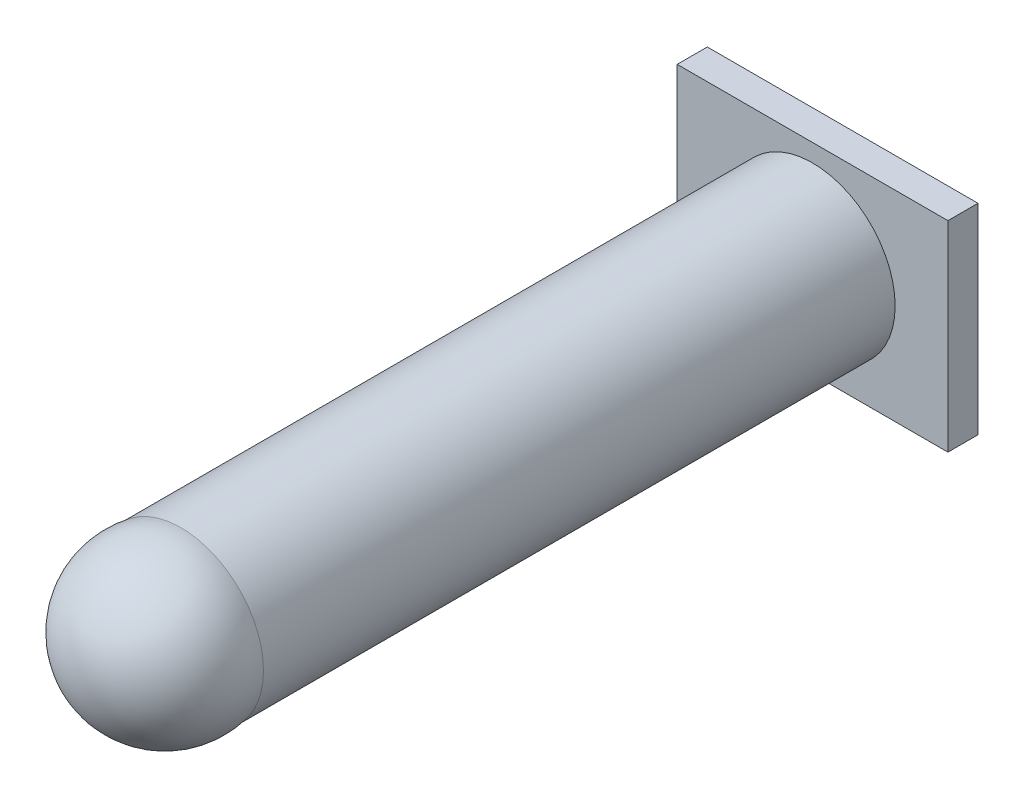
ISO-10303-21;
HEADER;
FILE_DESCRIPTION(('STEP AP214'),'2;1');
FILE_NAME('part.step','',(''),(''),'','','');
FILE_SCHEMA(('AUTOMOTIVE_DESIGN { 1 0 10303 214 1 1 1 1 }'));
ENDSEC;
DATA;
#1=APPLICATION_CONTEXT('core data for automotive mechanical design processes');
#2=APPLICATION_PROTOCOL_DEFINITION('international standard','automotive_design',2000,#1);
#3=PRODUCT_CONTEXT('',#1,'mechanical');
#4=PRODUCT('Part','Part','',(#3));
#5=PRODUCT_RELATED_PRODUCT_CATEGORY('part','',(#4));
#6=PRODUCT_DEFINITION_FORMATION('','',#4);
#7=PRODUCT_DEFINITION_CONTEXT('part definition',#1,'design');
#8=PRODUCT_DEFINITION('design','',#6,#7);
#9=PRODUCT_DEFINITION_SHAPE('','',#8);
#10=(LENGTH_UNIT() NAMED_UNIT(*) SI_UNIT(.MILLI.,.METRE.));
#11=(NAMED_UNIT(*) PLANE_ANGLE_UNIT() SI_UNIT($,.RADIAN.));
#12=(NAMED_UNIT(*) SI_UNIT($,.STERADIAN.) SOLID_ANGLE_UNIT());
#13=UNCERTAINTY_MEASURE_WITH_UNIT(LENGTH_MEASURE(1.E-05),#10,'distance_accuracy_value','');
#14=(GEOMETRIC_REPRESENTATION_CONTEXT(3) GLOBAL_UNCERTAINTY_ASSIGNED_CONTEXT((#13)) GLOBAL_UNIT_ASSIGNED_CONTEXT((#10,
#11,#12)) REPRESENTATION_CONTEXT('',''));
#15=CARTESIAN_POINT('',(0.,0.,0.));
#16=DIRECTION('',(0.,0.,1.));
#17=DIRECTION('',(1.,0.,0.));
#18=AXIS2_PLACEMENT_3D('',#15,#16,#17);
#19=CARTESIAN_POINT('',(-45.5198299492386,6.1198815566836,3.));
#20=DIRECTION('',(0.,0.,1.));
#21=DIRECTION('',(1.,0.,0.));
#22=AXIS2_PLACEMENT_3D('',#19,#20,#21);
#23=PLANE('',#22);
#24=DIRECTION('',(0.,-1.,0.));
#25=VECTOR('',#24,1.);
#26=CARTESIAN_POINT('',(-45.5198299492386,26.1198815566836,3.));
#27=LINE('',#26,#25);
#28=CARTESIAN_POINT('',(-45.5198299492386,26.1198815566836,3.));
#29=VERTEX_POINT('',#28);
#30=CARTESIAN_POINT('',(-45.5198299492386,6.1198815566836,3.));
#31=VERTEX_POINT('',#30);
#32=EDGE_CURVE('E86',#29,#31,#27,.T.);
#33=ORIENTED_EDGE('',*,*,#32,.T.);
#34=DIRECTION('',(1.,0.,0.));
#35=VECTOR('',#34,1.);
#36=CARTESIAN_POINT('',(-45.5198299492386,6.1198815566836,3.));
#37=LINE('',#36,#35);
#38=CARTESIAN_POINT('',(-18.5198299492386,6.1198815566836,3.));
#39=VERTEX_POINT('',#38);
#40=EDGE_CURVE('E81',#31,#39,#37,.T.);
#41=ORIENTED_EDGE('',*,*,#40,.T.);
#42=DIRECTION('',(0.,1.,0.));
#43=VECTOR('',#42,1.);
#44=CARTESIAN_POINT('',(-18.5198299492386,26.1198815566836,3.));
#45=LINE('',#44,#43);
#46=CARTESIAN_POINT('',(-18.5198299492386,26.1198815566836,3.));
#47=VERTEX_POINT('',#46);
#48=EDGE_CURVE('E84',#39,#47,#45,.T.);
#49=ORIENTED_EDGE('',*,*,#48,.T.);
#50=DIRECTION('',(-1.,0.,0.));
#51=VECTOR('',#50,1.);
#52=CARTESIAN_POINT('',(-45.5198299492386,26.1198815566836,3.));
#53=LINE('',#52,#51);
#54=EDGE_CURVE('E51',#47,#29,#53,.T.);
#55=ORIENTED_EDGE('',*,*,#54,.T.);
#56=EDGE_LOOP('',(#33,#41,#49,#55));
#57=FACE_BOUND('',#56,.T.);
#58=CARTESIAN_POINT('',(-32.0198299492386,16.1198815566836,3.));
#59=DIRECTION('',(0.,0.,1.));
#60=DIRECTION('',(1.,0.,0.));
#61=AXIS2_PLACEMENT_3D('',#58,#59,#60);
#62=CIRCLE('',#61,8.23653306005172);
#63=CARTESIAN_POINT('',(-23.7832968891869,16.1198815566836,3.));
#64=VERTEX_POINT('',#63);
#65=EDGE_CURVE('E113',#64,#64,#62,.T.);
#66=ORIENTED_EDGE('',*,*,#65,.F.);
#67=EDGE_LOOP('',(#66));
#68=FACE_BOUND('',#67,.T.);
#69=ADVANCED_FACE('F33',(#57,#68),#23,.T.);
#70=CARTESIAN_POINT('',(-45.5198299492386,26.1198815566836,3.));
#71=DIRECTION('',(1.,0.,0.));
#72=DIRECTION('',(0.,1.,0.));
#73=AXIS2_PLACEMENT_3D('',#70,#71,#72);
#74=PLANE('',#73);
#75=DIRECTION('',(0.,-1.,0.));
#76=VECTOR('',#75,1.);
#77=CARTESIAN_POINT('',(-45.5198299492386,26.1198815566836,0.));
#78=LINE('',#77,#76);
#79=CARTESIAN_POINT('',(-45.5198299492386,26.1198815566836,0.));
#80=VERTEX_POINT('',#79);
#81=CARTESIAN_POINT('',(-45.5198299492386,6.1198815566836,0.));
#82=VERTEX_POINT('',#81);
#83=EDGE_CURVE('E99',#80,#82,#78,.T.);
#84=ORIENTED_EDGE('',*,*,#83,.T.);
#85=DIRECTION('',(0.,0.,-1.));
#86=VECTOR('',#85,1.);
#87=CARTESIAN_POINT('',(-45.5198299492386,6.1198815566836,3.));
#88=LINE('',#87,#86);
#89=EDGE_CURVE('E11',#31,#82,#88,.T.);
#90=ORIENTED_EDGE('',*,*,#89,.F.);
#91=ORIENTED_EDGE('',*,*,#32,.F.);
#92=DIRECTION('',(0.,0.,-1.));
#93=VECTOR('',#92,1.);
#94=CARTESIAN_POINT('',(-45.5198299492386,26.1198815566836,3.));
#95=LINE('',#94,#93);
#96=EDGE_CURVE('E95',#29,#80,#95,.T.);
#97=ORIENTED_EDGE('',*,*,#96,.T.);
#98=EDGE_LOOP('',(#84,#90,#91,#97));
#99=FACE_BOUND('',#98,.T.);
#100=ADVANCED_FACE('F111',(#99),#74,.F.);
#101=CARTESIAN_POINT('',(-45.5198299492386,6.1198815566836,3.));
#102=DIRECTION('',(0.,1.,0.));
#103=DIRECTION('',(0.,0.,1.));
#104=AXIS2_PLACEMENT_3D('',#101,#102,#103);
#105=PLANE('',#104);
#106=DIRECTION('',(1.,0.,0.));
#107=VECTOR('',#106,1.);
#108=CARTESIAN_POINT('',(-45.5198299492386,6.1198815566836,0.));
#109=LINE('',#108,#107);
#110=CARTESIAN_POINT('',(-18.5198299492386,6.1198815566836,0.));
#111=VERTEX_POINT('',#110);
#112=EDGE_CURVE('E90',#82,#111,#109,.T.);
#113=ORIENTED_EDGE('',*,*,#112,.T.);
#114=DIRECTION('',(0.,0.,-1.));
#115=VECTOR('',#114,1.);
#116=CARTESIAN_POINT('',(-18.5198299492386,6.1198815566836,3.));
#117=LINE('',#116,#115);
#118=EDGE_CURVE('E43',#39,#111,#117,.T.);
#119=ORIENTED_EDGE('',*,*,#118,.F.);
#120=ORIENTED_EDGE('',*,*,#40,.F.);
#121=ORIENTED_EDGE('',*,*,#89,.T.);
#122=EDGE_LOOP('',(#113,#119,#120,#121));
#123=FACE_BOUND('',#122,.T.);
#124=ADVANCED_FACE('F89',(#123),#105,.F.);
#125=CARTESIAN_POINT('',(-18.5198299492386,26.1198815566836,3.));
#126=DIRECTION('',(-1.,0.,0.));
#127=DIRECTION('',(0.,-1.,0.));
#128=AXIS2_PLACEMENT_3D('',#125,#126,#127);
#129=PLANE('',#128);
#130=DIRECTION('',(0.,1.,0.));
#131=VECTOR('',#130,1.);
#132=CARTESIAN_POINT('',(-18.5198299492386,26.1198815566836,0.));
#133=LINE('',#132,#131);
#134=CARTESIAN_POINT('',(-18.5198299492386,26.1198815566836,0.));
#135=VERTEX_POINT('',#134);
#136=EDGE_CURVE('E68',#111,#135,#133,.T.);
#137=ORIENTED_EDGE('',*,*,#136,.T.);
#138=DIRECTION('',(0.,0.,-1.));
#139=VECTOR('',#138,1.);
#140=CARTESIAN_POINT('',(-18.5198299492386,26.1198815566836,3.));
#141=LINE('',#140,#139);
#142=EDGE_CURVE('E91',#47,#135,#141,.T.);
#143=ORIENTED_EDGE('',*,*,#142,.F.);
#144=ORIENTED_EDGE('',*,*,#48,.F.);
#145=ORIENTED_EDGE('',*,*,#118,.T.);
#146=EDGE_LOOP('',(#137,#143,#144,#145));
#147=FACE_BOUND('',#146,.T.);
#148=ADVANCED_FACE('F93',(#147),#129,.F.);
#149=CARTESIAN_POINT('',(-45.5198299492386,26.1198815566836,3.));
#150=DIRECTION('',(0.,-1.,0.));
#151=DIRECTION('',(0.,0.,-1.));
#152=AXIS2_PLACEMENT_3D('',#149,#150,#151);
#153=PLANE('',#152);
#154=DIRECTION('',(-1.,0.,0.));
#155=VECTOR('',#154,1.);
#156=CARTESIAN_POINT('',(-45.5198299492386,26.1198815566836,0.));
#157=LINE('',#156,#155);
#158=EDGE_CURVE('E74',#135,#80,#157,.T.);
#159=ORIENTED_EDGE('',*,*,#158,.T.);
#160=ORIENTED_EDGE('',*,*,#96,.F.);
#161=ORIENTED_EDGE('',*,*,#54,.F.);
#162=ORIENTED_EDGE('',*,*,#142,.T.);
#163=EDGE_LOOP('',(#159,#160,#161,#162));
#164=FACE_BOUND('',#163,.T.);
#165=ADVANCED_FACE('F106',(#164),#153,.F.);
#166=CARTESIAN_POINT('',(-45.5198299492386,6.1198815566836,0.));
#167=DIRECTION('',(0.,0.,1.));
#168=DIRECTION('',(1.,0.,0.));
#169=AXIS2_PLACEMENT_3D('',#166,#167,#168);
#170=PLANE('',#169);
#171=ORIENTED_EDGE('',*,*,#83,.F.);
#172=ORIENTED_EDGE('',*,*,#158,.F.);
#173=ORIENTED_EDGE('',*,*,#136,.F.);
#174=ORIENTED_EDGE('',*,*,#112,.F.);
#175=EDGE_LOOP('',(#171,#172,#173,#174));
#176=FACE_BOUND('',#175,.T.);
#177=ADVANCED_FACE('F109',(#176),#170,.F.);
#178=CARTESIAN_POINT('',(-32.0198299492386,16.1198815566836,66.));
#179=DIRECTION('',(0.,0.,-1.));
#180=DIRECTION('',(-1.,0.,0.));
#181=AXIS2_PLACEMENT_3D('',#178,#179,#180);
#182=CYLINDRICAL_SURFACE('',#181,8.23653306005172);
#183=CARTESIAN_POINT('',(-32.0198299492386,16.1198815566836,66.));
#184=DIRECTION('',(0.,0.,1.));
#185=DIRECTION('',(1.,0.,0.));
#186=AXIS2_PLACEMENT_3D('',#183,#184,#185);
#187=CIRCLE('',#186,8.23653306005172);
#188=CARTESIAN_POINT('',(-23.7832968891869,16.1198815566836,66.));
#189=VERTEX_POINT('',#188);
#190=EDGE_CURVE('E37',#189,#189,#187,.T.);
#191=ORIENTED_EDGE('',*,*,#190,.F.);
#192=EDGE_LOOP('',(#191));
#193=FACE_BOUND('',#192,.T.);
#194=ORIENTED_EDGE('',*,*,#65,.T.);
#195=EDGE_LOOP('',(#194));
#196=FACE_BOUND('',#195,.T.);
#197=ADVANCED_FACE('F121',(#193,#196),#182,.T.);
#198=CARTESIAN_POINT('',(-32.0198299492386,16.1198815566836,67.6079761575338));
#199=DIRECTION('',(0.,0.,1.));
#200=DIRECTION('',(1.,0.,0.));
#201=AXIS2_PLACEMENT_3D('',#198,#199,#200);
#202=SPHERICAL_SURFACE('',#201,8.39202384246625);
#203=ORIENTED_EDGE('',*,*,#190,.T.);
#204=EDGE_LOOP('',(#203));
#205=FACE_BOUND('',#204,.T.);
#206=ADVANCED_FACE('F35',(#205),#202,.T.);
#207=CLOSED_SHELL('',(#69,#100,#124,#148,#165,#177,#197,#206));
#208=MANIFOLD_SOLID_BREP('B2',#207);
#209=ADVANCED_BREP_SHAPE_REPRESENTATION('',(#18,#208),#14);
#210=SHAPE_DEFINITION_REPRESENTATION(#9,#209);
ENDSEC;
END-ISO-10303-21;
